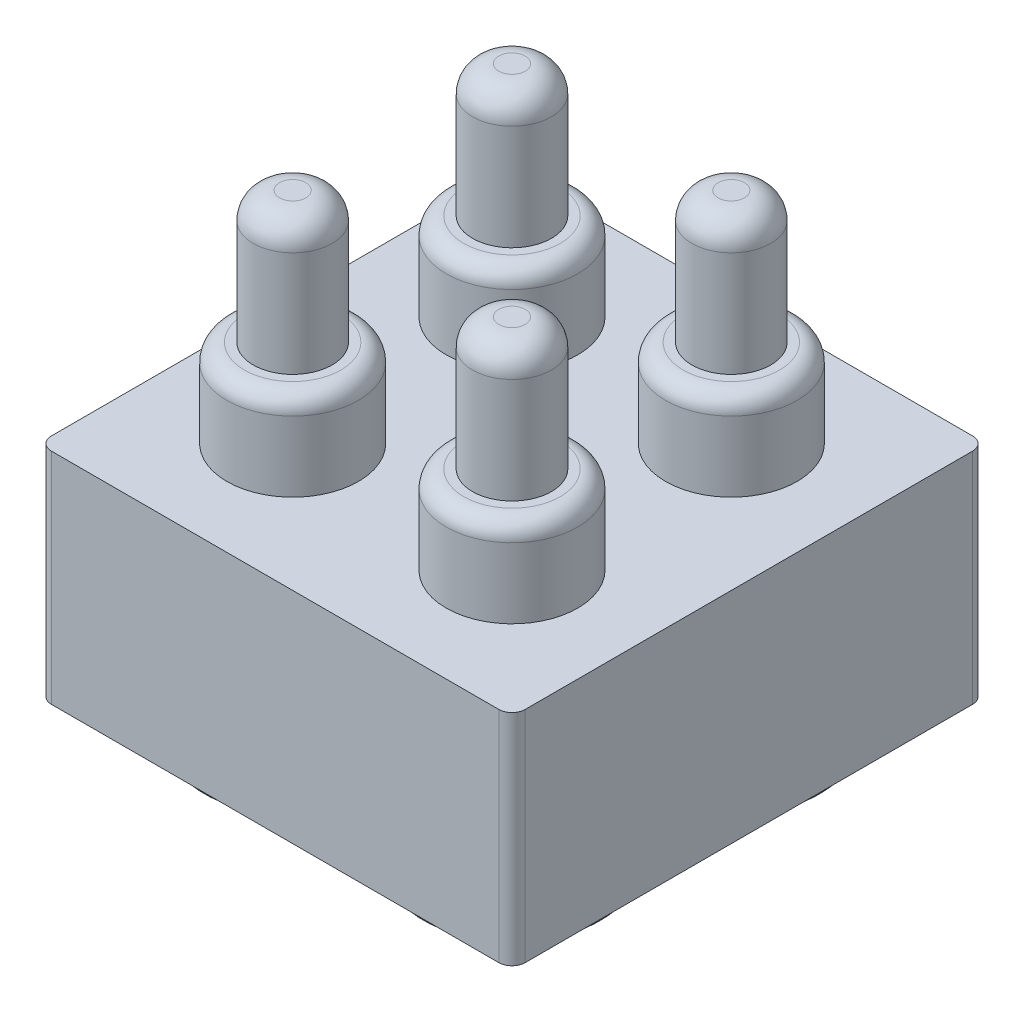
ISO-10303-21;
HEADER;
FILE_DESCRIPTION(('STEP AP214'),'2;1');
FILE_NAME('part.step','',(''),(''),'','','');
FILE_SCHEMA(('AUTOMOTIVE_DESIGN { 1 0 10303 214 1 1 1 1 }'));
ENDSEC;
DATA;
#1=APPLICATION_CONTEXT('core data for automotive mechanical design processes');
#2=APPLICATION_PROTOCOL_DEFINITION('international standard','automotive_design',2000,#1);
#3=PRODUCT_CONTEXT('',#1,'mechanical');
#4=PRODUCT('Part','Part','',(#3));
#5=PRODUCT_RELATED_PRODUCT_CATEGORY('part','',(#4));
#6=PRODUCT_DEFINITION_FORMATION('','',#4);
#7=PRODUCT_DEFINITION_CONTEXT('part definition',#1,'design');
#8=PRODUCT_DEFINITION('design','',#6,#7);
#9=PRODUCT_DEFINITION_SHAPE('','',#8);
#10=(LENGTH_UNIT() NAMED_UNIT(*) SI_UNIT(.MILLI.,.METRE.));
#11=(NAMED_UNIT(*) PLANE_ANGLE_UNIT() SI_UNIT($,.RADIAN.));
#12=(NAMED_UNIT(*) SI_UNIT($,.STERADIAN.) SOLID_ANGLE_UNIT());
#13=UNCERTAINTY_MEASURE_WITH_UNIT(LENGTH_MEASURE(1.E-05),#10,'distance_accuracy_value','');
#14=(GEOMETRIC_REPRESENTATION_CONTEXT(3) GLOBAL_UNCERTAINTY_ASSIGNED_CONTEXT((#13)) GLOBAL_UNIT_ASSIGNED_CONTEXT((#10,
#11,#12)) REPRESENTATION_CONTEXT('',''));
#15=CARTESIAN_POINT('',(0.,0.,0.));
#16=DIRECTION('',(0.,0.,1.));
#17=DIRECTION('',(1.,0.,0.));
#18=AXIS2_PLACEMENT_3D('',#15,#16,#17);
#19=CARTESIAN_POINT('',(-1.25,-0.5,-1.25));
#20=DIRECTION('',(0.,1.,0.));
#21=DIRECTION('',(0.,0.,1.));
#22=AXIS2_PLACEMENT_3D('',#19,#20,#21);
#23=CYLINDRICAL_SURFACE('',#22,1.05);
#24=CARTESIAN_POINT('',(-1.25,-0.35,-1.25));
#25=DIRECTION('',(0.,-1.,0.));
#26=DIRECTION('',(0.,0.,-1.));
#27=AXIS2_PLACEMENT_3D('',#24,#25,#26);
#28=CIRCLE('',#27,1.05);
#29=CARTESIAN_POINT('',(-1.25,-0.35,-2.3));
#30=VERTEX_POINT('',#29);
#31=EDGE_CURVE('E12',#30,#30,#28,.F.);
#32=ORIENTED_EDGE('',*,*,#31,.T.);
#33=EDGE_LOOP('',(#32));
#34=FACE_BOUND('',#33,.T.);
#35=CARTESIAN_POINT('',(-1.25,0.,-1.25));
#36=DIRECTION('',(0.,-1.,0.));
#37=DIRECTION('',(0.,0.,-1.));
#38=AXIS2_PLACEMENT_3D('',#35,#36,#37);
#39=CIRCLE('',#38,1.05);
#40=CARTESIAN_POINT('',(-1.25,0.,-2.3));
#41=VERTEX_POINT('',#40);
#42=EDGE_CURVE('E85',#41,#41,#39,.T.);
#43=ORIENTED_EDGE('',*,*,#42,.T.);
#44=EDGE_LOOP('',(#43));
#45=FACE_BOUND('',#44,.T.);
#46=ADVANCED_FACE('F74',(#34,#45),#23,.T.);
#47=CARTESIAN_POINT('',(-1.25,-0.5,-1.25));
#48=DIRECTION('',(0.,-1.,0.));
#49=DIRECTION('',(0.,0.,-1.));
#50=AXIS2_PLACEMENT_3D('',#47,#48,#49);
#51=PLANE('',#50);
#52=CARTESIAN_POINT('',(-1.25,-0.5,-1.25));
#53=DIRECTION('',(0.,-1.,0.));
#54=DIRECTION('',(0.,0.,-1.));
#55=AXIS2_PLACEMENT_3D('',#52,#53,#54);
#56=CIRCLE('',#55,0.9);
#57=CARTESIAN_POINT('',(-1.25,-0.5,-2.15));
#58=VERTEX_POINT('',#57);
#59=EDGE_CURVE('E81',#58,#58,#56,.T.);
#60=ORIENTED_EDGE('',*,*,#59,.T.);
#61=EDGE_LOOP('',(#60));
#62=FACE_BOUND('',#61,.T.);
#63=ADVANCED_FACE('F95',(#62),#51,.T.);
#64=CARTESIAN_POINT('',(-1.25,0.,-1.25));
#65=DIRECTION('',(0.,-1.,0.));
#66=DIRECTION('',(0.,0.,-1.));
#67=AXIS2_PLACEMENT_3D('',#64,#65,#66);
#68=PLANE('',#67);
#69=ORIENTED_EDGE('',*,*,#42,.F.);
#70=EDGE_LOOP('',(#69));
#71=FACE_BOUND('',#70,.T.);
#72=ADVANCED_FACE('F93',(#71),#68,.F.);
#73=CARTESIAN_POINT('',(-1.25,-0.35,-1.25));
#74=DIRECTION('',(0.,-1.,0.));
#75=DIRECTION('',(0.,0.,-1.));
#76=AXIS2_PLACEMENT_3D('',#73,#74,#75);
#77=TOROIDAL_SURFACE('',#76,0.9,0.15);
#78=ORIENTED_EDGE('',*,*,#31,.F.);
#79=EDGE_LOOP('',(#78));
#80=FACE_BOUND('',#79,.T.);
#81=ORIENTED_EDGE('',*,*,#59,.F.);
#82=EDGE_LOOP('',(#81));
#83=FACE_BOUND('',#82,.T.);
#84=ADVANCED_FACE('F76',(#80,#83),#77,.T.);
#85=CLOSED_SHELL('',(#46,#63,#72,#84));
#86=MANIFOLD_SOLID_BREP('B2',#85);
#87=CARTESIAN_POINT('',(1.25,-0.5,-1.25));
#88=DIRECTION('',(0.,1.,0.));
#89=DIRECTION('',(0.,0.,1.));
#90=AXIS2_PLACEMENT_3D('',#87,#88,#89);
#91=CYLINDRICAL_SURFACE('',#90,1.05);
#92=CARTESIAN_POINT('',(1.25,-0.35,-1.25));
#93=DIRECTION('',(0.,-1.,0.));
#94=DIRECTION('',(0.,0.,-1.));
#95=AXIS2_PLACEMENT_3D('',#92,#93,#94);
#96=CIRCLE('',#95,1.05);
#97=CARTESIAN_POINT('',(1.25,-0.35,-2.3));
#98=VERTEX_POINT('',#97);
#99=EDGE_CURVE('E73',#98,#98,#96,.F.);
#100=ORIENTED_EDGE('',*,*,#99,.T.);
#101=EDGE_LOOP('',(#100));
#102=FACE_BOUND('',#101,.T.);
#103=CARTESIAN_POINT('',(1.25,0.,-1.25));
#104=DIRECTION('',(0.,-1.,0.));
#105=DIRECTION('',(0.,0.,-1.));
#106=AXIS2_PLACEMENT_3D('',#103,#104,#105);
#107=CIRCLE('',#106,1.05);
#108=CARTESIAN_POINT('',(1.25,0.,-2.3));
#109=VERTEX_POINT('',#108);
#110=EDGE_CURVE('E149',#109,#109,#107,.T.);
#111=ORIENTED_EDGE('',*,*,#110,.T.);
#112=EDGE_LOOP('',(#111));
#113=FACE_BOUND('',#112,.T.);
#114=ADVANCED_FACE('F138',(#102,#113),#91,.T.);
#115=CARTESIAN_POINT('',(1.25,-0.5,-1.25));
#116=DIRECTION('',(0.,-1.,0.));
#117=DIRECTION('',(0.,0.,-1.));
#118=AXIS2_PLACEMENT_3D('',#115,#116,#117);
#119=PLANE('',#118);
#120=CARTESIAN_POINT('',(1.25,-0.5,-1.25));
#121=DIRECTION('',(0.,-1.,0.));
#122=DIRECTION('',(0.,0.,-1.));
#123=AXIS2_PLACEMENT_3D('',#120,#121,#122);
#124=CIRCLE('',#123,0.9);
#125=CARTESIAN_POINT('',(1.25,-0.5,-2.15));
#126=VERTEX_POINT('',#125);
#127=EDGE_CURVE('E145',#126,#126,#124,.T.);
#128=ORIENTED_EDGE('',*,*,#127,.T.);
#129=EDGE_LOOP('',(#128));
#130=FACE_BOUND('',#129,.T.);
#131=ADVANCED_FACE('F159',(#130),#119,.T.);
#132=CARTESIAN_POINT('',(1.25,0.,-1.25));
#133=DIRECTION('',(0.,-1.,0.));
#134=DIRECTION('',(0.,0.,-1.));
#135=AXIS2_PLACEMENT_3D('',#132,#133,#134);
#136=PLANE('',#135);
#137=ORIENTED_EDGE('',*,*,#110,.F.);
#138=EDGE_LOOP('',(#137));
#139=FACE_BOUND('',#138,.T.);
#140=ADVANCED_FACE('F157',(#139),#136,.F.);
#141=CARTESIAN_POINT('',(1.25,-0.35,-1.25));
#142=DIRECTION('',(0.,-1.,0.));
#143=DIRECTION('',(0.,0.,-1.));
#144=AXIS2_PLACEMENT_3D('',#141,#142,#143);
#145=TOROIDAL_SURFACE('',#144,0.9,0.15);
#146=ORIENTED_EDGE('',*,*,#99,.F.);
#147=EDGE_LOOP('',(#146));
#148=FACE_BOUND('',#147,.T.);
#149=ORIENTED_EDGE('',*,*,#127,.F.);
#150=EDGE_LOOP('',(#149));
#151=FACE_BOUND('',#150,.T.);
#152=ADVANCED_FACE('F140',(#148,#151),#145,.T.);
#153=CLOSED_SHELL('',(#114,#131,#140,#152));
#154=MANIFOLD_SOLID_BREP('B7',#153);
#155=CARTESIAN_POINT('',(1.25,-0.5,1.25));
#156=DIRECTION('',(0.,1.,0.));
#157=DIRECTION('',(0.,0.,1.));
#158=AXIS2_PLACEMENT_3D('',#155,#156,#157);
#159=CYLINDRICAL_SURFACE('',#158,1.05);
#160=CARTESIAN_POINT('',(1.25,-0.35,1.25));
#161=DIRECTION('',(0.,-1.,0.));
#162=DIRECTION('',(0.,0.,-1.));
#163=AXIS2_PLACEMENT_3D('',#160,#161,#162);
#164=CIRCLE('',#163,1.05);
#165=CARTESIAN_POINT('',(1.25,-0.35,0.2));
#166=VERTEX_POINT('',#165);
#167=EDGE_CURVE('E137',#166,#166,#164,.F.);
#168=ORIENTED_EDGE('',*,*,#167,.T.);
#169=EDGE_LOOP('',(#168));
#170=FACE_BOUND('',#169,.T.);
#171=CARTESIAN_POINT('',(1.25,0.,1.25));
#172=DIRECTION('',(0.,-1.,0.));
#173=DIRECTION('',(0.,0.,-1.));
#174=AXIS2_PLACEMENT_3D('',#171,#172,#173);
#175=CIRCLE('',#174,1.05);
#176=CARTESIAN_POINT('',(1.25,0.,0.2));
#177=VERTEX_POINT('',#176);
#178=EDGE_CURVE('E213',#177,#177,#175,.T.);
#179=ORIENTED_EDGE('',*,*,#178,.T.);
#180=EDGE_LOOP('',(#179));
#181=FACE_BOUND('',#180,.T.);
#182=ADVANCED_FACE('F202',(#170,#181),#159,.T.);
#183=CARTESIAN_POINT('',(1.25,-0.5,1.25));
#184=DIRECTION('',(0.,-1.,0.));
#185=DIRECTION('',(0.,0.,-1.));
#186=AXIS2_PLACEMENT_3D('',#183,#184,#185);
#187=PLANE('',#186);
#188=CARTESIAN_POINT('',(1.25,-0.5,1.25));
#189=DIRECTION('',(0.,-1.,0.));
#190=DIRECTION('',(0.,0.,-1.));
#191=AXIS2_PLACEMENT_3D('',#188,#189,#190);
#192=CIRCLE('',#191,0.9);
#193=CARTESIAN_POINT('',(1.25,-0.5,0.35));
#194=VERTEX_POINT('',#193);
#195=EDGE_CURVE('E209',#194,#194,#192,.T.);
#196=ORIENTED_EDGE('',*,*,#195,.T.);
#197=EDGE_LOOP('',(#196));
#198=FACE_BOUND('',#197,.T.);
#199=ADVANCED_FACE('F223',(#198),#187,.T.);
#200=CARTESIAN_POINT('',(1.25,0.,1.25));
#201=DIRECTION('',(0.,-1.,0.));
#202=DIRECTION('',(0.,0.,-1.));
#203=AXIS2_PLACEMENT_3D('',#200,#201,#202);
#204=PLANE('',#203);
#205=ORIENTED_EDGE('',*,*,#178,.F.);
#206=EDGE_LOOP('',(#205));
#207=FACE_BOUND('',#206,.T.);
#208=ADVANCED_FACE('F221',(#207),#204,.F.);
#209=CARTESIAN_POINT('',(1.25,-0.35,1.25));
#210=DIRECTION('',(0.,-1.,0.));
#211=DIRECTION('',(0.,0.,-1.));
#212=AXIS2_PLACEMENT_3D('',#209,#210,#211);
#213=TOROIDAL_SURFACE('',#212,0.9,0.15);
#214=ORIENTED_EDGE('',*,*,#167,.F.);
#215=EDGE_LOOP('',(#214));
#216=FACE_BOUND('',#215,.T.);
#217=ORIENTED_EDGE('',*,*,#195,.F.);
#218=EDGE_LOOP('',(#217));
#219=FACE_BOUND('',#218,.T.);
#220=ADVANCED_FACE('F204',(#216,#219),#213,.T.);
#221=CLOSED_SHELL('',(#182,#199,#208,#220));
#222=MANIFOLD_SOLID_BREP('B68',#221);
#223=CARTESIAN_POINT('',(-1.25,-0.5,1.25));
#224=DIRECTION('',(0.,1.,0.));
#225=DIRECTION('',(0.,0.,1.));
#226=AXIS2_PLACEMENT_3D('',#223,#224,#225);
#227=CYLINDRICAL_SURFACE('',#226,1.05);
#228=CARTESIAN_POINT('',(-1.25,-0.35,1.25));
#229=DIRECTION('',(0.,-1.,0.));
#230=DIRECTION('',(0.,0.,-1.));
#231=AXIS2_PLACEMENT_3D('',#228,#229,#230);
#232=CIRCLE('',#231,1.05);
#233=CARTESIAN_POINT('',(-1.25,-0.35,0.199999999999998));
#234=VERTEX_POINT('',#233);
#235=EDGE_CURVE('E201',#234,#234,#232,.F.);
#236=ORIENTED_EDGE('',*,*,#235,.T.);
#237=EDGE_LOOP('',(#236));
#238=FACE_BOUND('',#237,.T.);
#239=CARTESIAN_POINT('',(-1.25,0.,1.25));
#240=DIRECTION('',(0.,-1.,0.));
#241=DIRECTION('',(0.,0.,-1.));
#242=AXIS2_PLACEMENT_3D('',#239,#240,#241);
#243=CIRCLE('',#242,1.05);
#244=CARTESIAN_POINT('',(-1.25,0.,0.199999999999998));
#245=VERTEX_POINT('',#244);
#246=EDGE_CURVE('E277',#245,#245,#243,.T.);
#247=ORIENTED_EDGE('',*,*,#246,.T.);
#248=EDGE_LOOP('',(#247));
#249=FACE_BOUND('',#248,.T.);
#250=ADVANCED_FACE('F266',(#238,#249),#227,.T.);
#251=CARTESIAN_POINT('',(-1.25,-0.5,1.25));
#252=DIRECTION('',(0.,-1.,0.));
#253=DIRECTION('',(0.,0.,-1.));
#254=AXIS2_PLACEMENT_3D('',#251,#252,#253);
#255=PLANE('',#254);
#256=CARTESIAN_POINT('',(-1.25,-0.5,1.25));
#257=DIRECTION('',(0.,-1.,0.));
#258=DIRECTION('',(0.,0.,-1.));
#259=AXIS2_PLACEMENT_3D('',#256,#257,#258);
#260=CIRCLE('',#259,0.9);
#261=CARTESIAN_POINT('',(-1.25,-0.5,0.349999999999998));
#262=VERTEX_POINT('',#261);
#263=EDGE_CURVE('E273',#262,#262,#260,.T.);
#264=ORIENTED_EDGE('',*,*,#263,.T.);
#265=EDGE_LOOP('',(#264));
#266=FACE_BOUND('',#265,.T.);
#267=ADVANCED_FACE('F287',(#266),#255,.T.);
#268=CARTESIAN_POINT('',(-1.25,0.,1.25));
#269=DIRECTION('',(0.,-1.,0.));
#270=DIRECTION('',(0.,0.,-1.));
#271=AXIS2_PLACEMENT_3D('',#268,#269,#270);
#272=PLANE('',#271);
#273=ORIENTED_EDGE('',*,*,#246,.F.);
#274=EDGE_LOOP('',(#273));
#275=FACE_BOUND('',#274,.T.);
#276=ADVANCED_FACE('F285',(#275),#272,.F.);
#277=CARTESIAN_POINT('',(-1.25,-0.35,1.25));
#278=DIRECTION('',(0.,-1.,0.));
#279=DIRECTION('',(0.,0.,-1.));
#280=AXIS2_PLACEMENT_3D('',#277,#278,#279);
#281=TOROIDAL_SURFACE('',#280,0.9,0.15);
#282=ORIENTED_EDGE('',*,*,#235,.F.);
#283=EDGE_LOOP('',(#282));
#284=FACE_BOUND('',#283,.T.);
#285=ORIENTED_EDGE('',*,*,#263,.F.);
#286=EDGE_LOOP('',(#285));
#287=FACE_BOUND('',#286,.T.);
#288=ADVANCED_FACE('F268',(#284,#287),#281,.T.);
#289=CLOSED_SHELL('',(#250,#267,#276,#288));
#290=MANIFOLD_SOLID_BREP('B132',#289);
#291=CARTESIAN_POINT('',(1.25,3.5,1.25));
#292=DIRECTION('',(0.,-1.,0.));
#293=DIRECTION('',(0.,0.,-1.));
#294=AXIS2_PLACEMENT_3D('',#291,#292,#293);
#295=CYLINDRICAL_SURFACE('',#294,0.749999999999999);
#296=CARTESIAN_POINT('',(1.25,3.3,1.25));
#297=DIRECTION('',(0.,1.,0.));
#298=DIRECTION('',(0.,0.,1.));
#299=AXIS2_PLACEMENT_3D('',#296,#297,#298);
#300=CIRCLE('',#299,0.749999999999999);
#301=CARTESIAN_POINT('',(1.25,3.3,2.));
#302=VERTEX_POINT('',#301);
#303=EDGE_CURVE('E341',#302,#302,#300,.F.);
#304=ORIENTED_EDGE('',*,*,#303,.T.);
#305=EDGE_LOOP('',(#304));
#306=FACE_BOUND('',#305,.T.);
#307=CARTESIAN_POINT('',(1.25,2.5,1.25));
#308=DIRECTION('',(0.,1.,0.));
#309=DIRECTION('',(0.,0.,1.));
#310=AXIS2_PLACEMENT_3D('',#307,#308,#309);
#311=CIRCLE('',#310,0.749999999999999);
#312=CARTESIAN_POINT('',(1.25,2.5,2.));
#313=VERTEX_POINT('',#312);
#314=EDGE_CURVE('E351',#313,#313,#311,.T.);
#315=ORIENTED_EDGE('',*,*,#314,.T.);
#316=EDGE_LOOP('',(#315));
#317=FACE_BOUND('',#316,.T.);
#318=ADVANCED_FACE('F330',(#306,#317),#295,.T.);
#319=CARTESIAN_POINT('',(0.,3.5,0.));
#320=DIRECTION('',(0.,1.,0.));
#321=DIRECTION('',(0.,0.,1.));
#322=AXIS2_PLACEMENT_3D('',#319,#320,#321);
#323=PLANE('',#322);
#324=CARTESIAN_POINT('',(1.25,3.5,1.25));
#325=DIRECTION('',(0.,1.,0.));
#326=DIRECTION('',(0.,0.,1.));
#327=AXIS2_PLACEMENT_3D('',#324,#325,#326);
#328=CIRCLE('',#327,0.549999999999999);
#329=CARTESIAN_POINT('',(1.25,3.5,1.8));
#330=VERTEX_POINT('',#329);
#331=EDGE_CURVE('E345',#330,#330,#328,.T.);
#332=ORIENTED_EDGE('',*,*,#331,.T.);
#333=EDGE_LOOP('',(#332));
#334=FACE_BOUND('',#333,.T.);
#335=CARTESIAN_POINT('',(1.25,3.5,1.25));
#336=DIRECTION('',(0.,1.,0.));
#337=DIRECTION('',(0.,0.,1.));
#338=AXIS2_PLACEMENT_3D('',#335,#336,#337);
#339=CIRCLE('',#338,0.449999999999999);
#340=CARTESIAN_POINT('',(1.25,3.5,1.7));
#341=VERTEX_POINT('',#340);
#342=EDGE_CURVE('E350',#341,#341,#339,.T.);
#343=ORIENTED_EDGE('',*,*,#342,.F.);
#344=EDGE_LOOP('',(#343));
#345=FACE_BOUND('',#344,.T.);
#346=ADVANCED_FACE('F359',(#334,#345),#323,.T.);
#347=CARTESIAN_POINT('',(0.,2.5,0.));
#348=DIRECTION('',(0.,1.,0.));
#349=DIRECTION('',(0.,0.,1.));
#350=AXIS2_PLACEMENT_3D('',#347,#348,#349);
#351=PLANE('',#350);
#352=ORIENTED_EDGE('',*,*,#314,.F.);
#353=EDGE_LOOP('',(#352));
#354=FACE_BOUND('',#353,.T.);
#355=ADVANCED_FACE('F361',(#354),#351,.F.);
#356=CARTESIAN_POINT('',(1.25,5.,1.25));
#357=DIRECTION('',(0.,-1.,0.));
#358=DIRECTION('',(0.,0.,-1.));
#359=AXIS2_PLACEMENT_3D('',#356,#357,#358);
#360=CYLINDRICAL_SURFACE('',#359,0.449999999999999);
#361=CARTESIAN_POINT('',(1.25,4.7,1.25));
#362=DIRECTION('',(0.,1.,0.));
#363=DIRECTION('',(0.,0.,1.));
#364=AXIS2_PLACEMENT_3D('',#361,#362,#363);
#365=CIRCLE('',#364,0.449999999999999);
#366=CARTESIAN_POINT('',(1.25,4.7,1.7));
#367=VERTEX_POINT('',#366);
#368=EDGE_CURVE('E265',#367,#367,#365,.F.);
#369=ORIENTED_EDGE('',*,*,#368,.T.);
#370=EDGE_LOOP('',(#369));
#371=FACE_BOUND('',#370,.T.);
#372=ORIENTED_EDGE('',*,*,#342,.T.);
#373=EDGE_LOOP('',(#372));
#374=FACE_BOUND('',#373,.T.);
#375=ADVANCED_FACE('F357',(#371,#374),#360,.T.);
#376=CARTESIAN_POINT('',(1.25,5.,1.25));
#377=DIRECTION('',(0.,1.,0.));
#378=DIRECTION('',(0.,0.,1.));
#379=AXIS2_PLACEMENT_3D('',#376,#377,#378);
#380=PLANE('',#379);
#381=CARTESIAN_POINT('',(1.25,5.,1.25));
#382=DIRECTION('',(0.,1.,0.));
#383=DIRECTION('',(0.,0.,1.));
#384=AXIS2_PLACEMENT_3D('',#381,#382,#383);
#385=CIRCLE('',#384,0.149999999999999);
#386=CARTESIAN_POINT('',(1.25,5.,1.4));
#387=VERTEX_POINT('',#386);
#388=EDGE_CURVE('E337',#387,#387,#385,.T.);
#389=ORIENTED_EDGE('',*,*,#388,.T.);
#390=EDGE_LOOP('',(#389));
#391=FACE_BOUND('',#390,.T.);
#392=ADVANCED_FACE('F376',(#391),#380,.T.);
#393=CARTESIAN_POINT('',(1.25,3.3,1.25));
#394=DIRECTION('',(0.,1.,0.));
#395=DIRECTION('',(0.,0.,1.));
#396=AXIS2_PLACEMENT_3D('',#393,#394,#395);
#397=TOROIDAL_SURFACE('',#396,0.549999999999999,0.2);
#398=ORIENTED_EDGE('',*,*,#303,.F.);
#399=EDGE_LOOP('',(#398));
#400=FACE_BOUND('',#399,.T.);
#401=ORIENTED_EDGE('',*,*,#331,.F.);
#402=EDGE_LOOP('',(#401));
#403=FACE_BOUND('',#402,.T.);
#404=ADVANCED_FACE('F374',(#400,#403),#397,.T.);
#405=CARTESIAN_POINT('',(1.25,4.7,1.25));
#406=DIRECTION('',(0.,1.,0.));
#407=DIRECTION('',(0.,0.,1.));
#408=AXIS2_PLACEMENT_3D('',#405,#406,#407);
#409=DEGENERATE_TOROIDAL_SURFACE('',#408,0.149999999999999,0.3,.T.);
#410=ORIENTED_EDGE('',*,*,#368,.F.);
#411=EDGE_LOOP('',(#410));
#412=FACE_BOUND('',#411,.T.);
#413=ORIENTED_EDGE('',*,*,#388,.F.);
#414=EDGE_LOOP('',(#413));
#415=FACE_BOUND('',#414,.T.);
#416=ADVANCED_FACE('F332',(#412,#415),#409,.T.);
#417=CLOSED_SHELL('',(#318,#346,#355,#375,#392,#404,#416));
#418=MANIFOLD_SOLID_BREP('B196',#417);
#419=CARTESIAN_POINT('',(-1.25,3.5,1.25));
#420=DIRECTION('',(0.,-1.,0.));
#421=DIRECTION('',(0.,0.,-1.));
#422=AXIS2_PLACEMENT_3D('',#419,#420,#421);
#423=CYLINDRICAL_SURFACE('',#422,0.749999999999999);
#424=CARTESIAN_POINT('',(-1.25,3.3,1.25));
#425=DIRECTION('',(0.,1.,0.));
#426=DIRECTION('',(0.,0.,1.));
#427=AXIS2_PLACEMENT_3D('',#424,#425,#426);
#428=CIRCLE('',#427,0.749999999999999);
#429=CARTESIAN_POINT('',(-1.25,3.3,2.));
#430=VERTEX_POINT('',#429);
#431=EDGE_CURVE('E475',#430,#430,#428,.F.);
#432=ORIENTED_EDGE('',*,*,#431,.T.);
#433=EDGE_LOOP('',(#432));
#434=FACE_BOUND('',#433,.T.);
#435=CARTESIAN_POINT('',(-1.25,2.5,1.25));
#436=DIRECTION('',(0.,1.,0.));
#437=DIRECTION('',(0.,0.,1.));
#438=AXIS2_PLACEMENT_3D('',#435,#436,#437);
#439=CIRCLE('',#438,0.749999999999999);
#440=CARTESIAN_POINT('',(-1.25,2.5,2.));
#441=VERTEX_POINT('',#440);
#442=EDGE_CURVE('E481',#441,#441,#439,.F.);
#443=ORIENTED_EDGE('',*,*,#442,.F.);
#444=EDGE_LOOP('',(#443));
#445=FACE_BOUND('',#444,.T.);
#446=ADVANCED_FACE('F460',(#434,#445),#423,.T.);
#447=CARTESIAN_POINT('',(0.,3.5,0.));
#448=DIRECTION('',(0.,1.,0.));
#449=DIRECTION('',(0.,0.,1.));
#450=AXIS2_PLACEMENT_3D('',#447,#448,#449);
#451=PLANE('',#450);
#452=CARTESIAN_POINT('',(-1.25,3.5,1.25));
#453=DIRECTION('',(0.,1.,0.));
#454=DIRECTION('',(0.,0.,1.));
#455=AXIS2_PLACEMENT_3D('',#452,#453,#454);
#456=CIRCLE('',#455,0.549999999999999);
#457=CARTESIAN_POINT('',(-1.25,3.5,1.8));
#458=VERTEX_POINT('',#457);
#459=EDGE_CURVE('E471',#458,#458,#456,.T.);
#460=ORIENTED_EDGE('',*,*,#459,.T.);
#461=EDGE_LOOP('',(#460));
#462=FACE_BOUND('',#461,.T.);
#463=CARTESIAN_POINT('',(-1.25,3.5,1.25));
#464=DIRECTION('',(0.,1.,0.));
#465=DIRECTION('',(0.,0.,-1.));
#466=AXIS2_PLACEMENT_3D('',#463,#464,#465);
#467=CIRCLE('',#466,0.45);
#468=CARTESIAN_POINT('',(-1.25,3.5,0.799999999999998));
#469=VERTEX_POINT('',#468);
#470=EDGE_CURVE('E480',#469,#469,#467,.T.);
#471=ORIENTED_EDGE('',*,*,#470,.F.);
#472=EDGE_LOOP('',(#471));
#473=FACE_BOUND('',#472,.T.);
#474=ADVANCED_FACE('F489',(#462,#473),#451,.T.);
#475=CARTESIAN_POINT('',(0.,2.5,0.));
#476=DIRECTION('',(0.,1.,0.));
#477=DIRECTION('',(0.,0.,1.));
#478=AXIS2_PLACEMENT_3D('',#475,#476,#477);
#479=PLANE('',#478);
#480=ORIENTED_EDGE('',*,*,#442,.T.);
#481=EDGE_LOOP('',(#480));
#482=FACE_BOUND('',#481,.T.);
#483=ADVANCED_FACE('F491',(#482),#479,.F.);
#484=CARTESIAN_POINT('',(-1.25,5.,1.25));
#485=DIRECTION('',(0.,-1.,0.));
#486=DIRECTION('',(0.,0.,-1.));
#487=AXIS2_PLACEMENT_3D('',#484,#485,#486);
#488=CYLINDRICAL_SURFACE('',#487,0.45);
#489=CARTESIAN_POINT('',(-1.25,4.7,1.25));
#490=DIRECTION('',(0.,-1.,0.));
#491=DIRECTION('',(0.,0.,-1.));
#492=AXIS2_PLACEMENT_3D('',#489,#490,#491);
#493=CIRCLE('',#492,0.45);
#494=CARTESIAN_POINT('',(-1.25,4.7,0.799999999999998));
#495=VERTEX_POINT('',#494);
#496=EDGE_CURVE('E329',#495,#495,#493,.T.);
#497=ORIENTED_EDGE('',*,*,#496,.T.);
#498=EDGE_LOOP('',(#497));
#499=FACE_BOUND('',#498,.T.);
#500=ORIENTED_EDGE('',*,*,#470,.T.);
#501=EDGE_LOOP('',(#500));
#502=FACE_BOUND('',#501,.T.);
#503=ADVANCED_FACE('F487',(#499,#502),#488,.T.);
#504=CARTESIAN_POINT('',(-1.25,5.,1.25));
#505=DIRECTION('',(0.,-1.,0.));
#506=DIRECTION('',(0.,0.,-1.));
#507=AXIS2_PLACEMENT_3D('',#504,#505,#506);
#508=PLANE('',#507);
#509=CARTESIAN_POINT('',(-1.25,5.,1.25));
#510=DIRECTION('',(0.,-1.,0.));
#511=DIRECTION('',(0.,0.,-1.));
#512=AXIS2_PLACEMENT_3D('',#509,#510,#511);
#513=CIRCLE('',#512,0.15);
#514=CARTESIAN_POINT('',(-1.25,5.,1.1));
#515=VERTEX_POINT('',#514);
#516=EDGE_CURVE('E467',#515,#515,#513,.F.);
#517=ORIENTED_EDGE('',*,*,#516,.T.);
#518=EDGE_LOOP('',(#517));
#519=FACE_BOUND('',#518,.T.);
#520=ADVANCED_FACE('F506',(#519),#508,.F.);
#521=CARTESIAN_POINT('',(-1.25,3.3,1.25));
#522=DIRECTION('',(0.,1.,0.));
#523=DIRECTION('',(0.,0.,1.));
#524=AXIS2_PLACEMENT_3D('',#521,#522,#523);
#525=TOROIDAL_SURFACE('',#524,0.549999999999999,0.2);
#526=ORIENTED_EDGE('',*,*,#459,.F.);
#527=EDGE_LOOP('',(#526));
#528=FACE_BOUND('',#527,.T.);
#529=ORIENTED_EDGE('',*,*,#431,.F.);
#530=EDGE_LOOP('',(#529));
#531=FACE_BOUND('',#530,.T.);
#532=ADVANCED_FACE('F504',(#528,#531),#525,.T.);
#533=CARTESIAN_POINT('',(-1.25,4.7,1.25));
#534=DIRECTION('',(0.,-1.,0.));
#535=DIRECTION('',(0.,0.,-1.));
#536=AXIS2_PLACEMENT_3D('',#533,#534,#535);
#537=DEGENERATE_TOROIDAL_SURFACE('',#536,0.15,0.3,.T.);
#538=ORIENTED_EDGE('',*,*,#496,.F.);
#539=EDGE_LOOP('',(#538));
#540=FACE_BOUND('',#539,.T.);
#541=ORIENTED_EDGE('',*,*,#516,.F.);
#542=EDGE_LOOP('',(#541));
#543=FACE_BOUND('',#542,.T.);
#544=ADVANCED_FACE('F462',(#540,#543),#537,.T.);
#545=CLOSED_SHELL('',(#446,#474,#483,#503,#520,#532,#544));
#546=MANIFOLD_SOLID_BREP('B260',#545);
#547=CARTESIAN_POINT('',(1.25,3.5,-1.25));
#548=DIRECTION('',(0.,-1.,0.));
#549=DIRECTION('',(0.,0.,-1.));
#550=AXIS2_PLACEMENT_3D('',#547,#548,#549);
#551=CYLINDRICAL_SURFACE('',#550,0.75);
#552=CARTESIAN_POINT('',(1.25,3.3,-1.25));
#553=DIRECTION('',(0.,1.,0.));
#554=DIRECTION('',(0.,0.,1.));
#555=AXIS2_PLACEMENT_3D('',#552,#553,#554);
#556=CIRCLE('',#555,0.75);
#557=CARTESIAN_POINT('',(1.25,3.3,-0.5));
#558=VERTEX_POINT('',#557);
#559=EDGE_CURVE('E605',#558,#558,#556,.F.);
#560=ORIENTED_EDGE('',*,*,#559,.T.);
#561=EDGE_LOOP('',(#560));
#562=FACE_BOUND('',#561,.T.);
#563=CARTESIAN_POINT('',(1.25,2.5,-1.25));
#564=DIRECTION('',(0.,1.,0.));
#565=DIRECTION('',(0.,0.,1.));
#566=AXIS2_PLACEMENT_3D('',#563,#564,#565);
#567=CIRCLE('',#566,0.75);
#568=CARTESIAN_POINT('',(1.25,2.5,-0.5));
#569=VERTEX_POINT('',#568);
#570=EDGE_CURVE('E611',#569,#569,#567,.F.);
#571=ORIENTED_EDGE('',*,*,#570,.F.);
#572=EDGE_LOOP('',(#571));
#573=FACE_BOUND('',#572,.T.);
#574=ADVANCED_FACE('F590',(#562,#573),#551,.T.);
#575=CARTESIAN_POINT('',(0.,3.5,0.));
#576=DIRECTION('',(0.,1.,0.));
#577=DIRECTION('',(0.,0.,1.));
#578=AXIS2_PLACEMENT_3D('',#575,#576,#577);
#579=PLANE('',#578);
#580=CARTESIAN_POINT('',(1.25,3.5,-1.25));
#581=DIRECTION('',(0.,1.,0.));
#582=DIRECTION('',(0.,0.,1.));
#583=AXIS2_PLACEMENT_3D('',#580,#581,#582);
#584=CIRCLE('',#583,0.55);
#585=CARTESIAN_POINT('',(1.25,3.5,-0.7));
#586=VERTEX_POINT('',#585);
#587=EDGE_CURVE('E601',#586,#586,#584,.T.);
#588=ORIENTED_EDGE('',*,*,#587,.T.);
#589=EDGE_LOOP('',(#588));
#590=FACE_BOUND('',#589,.T.);
#591=CARTESIAN_POINT('',(1.25,3.5,-1.25));
#592=DIRECTION('',(0.,1.,0.));
#593=DIRECTION('',(0.,0.,-1.));
#594=AXIS2_PLACEMENT_3D('',#591,#592,#593);
#595=CIRCLE('',#594,0.45);
#596=CARTESIAN_POINT('',(1.25,3.5,-1.7));
#597=VERTEX_POINT('',#596);
#598=EDGE_CURVE('E610',#597,#597,#595,.T.);
#599=ORIENTED_EDGE('',*,*,#598,.F.);
#600=EDGE_LOOP('',(#599));
#601=FACE_BOUND('',#600,.T.);
#602=ADVANCED_FACE('F619',(#590,#601),#579,.T.);
#603=CARTESIAN_POINT('',(0.,2.5,0.));
#604=DIRECTION('',(0.,1.,0.));
#605=DIRECTION('',(0.,0.,1.));
#606=AXIS2_PLACEMENT_3D('',#603,#604,#605);
#607=PLANE('',#606);
#608=ORIENTED_EDGE('',*,*,#570,.T.);
#609=EDGE_LOOP('',(#608));
#610=FACE_BOUND('',#609,.T.);
#611=ADVANCED_FACE('F621',(#610),#607,.F.);
#612=CARTESIAN_POINT('',(1.25,5.,-1.25));
#613=DIRECTION('',(0.,-1.,0.));
#614=DIRECTION('',(0.,0.,-1.));
#615=AXIS2_PLACEMENT_3D('',#612,#613,#614);
#616=CYLINDRICAL_SURFACE('',#615,0.45);
#617=CARTESIAN_POINT('',(1.25,4.7,-1.25));
#618=DIRECTION('',(0.,-1.,0.));
#619=DIRECTION('',(0.,0.,-1.));
#620=AXIS2_PLACEMENT_3D('',#617,#618,#619);
#621=CIRCLE('',#620,0.45);
#622=CARTESIAN_POINT('',(1.25,4.7,-1.7));
#623=VERTEX_POINT('',#622);
#624=EDGE_CURVE('E459',#623,#623,#621,.T.);
#625=ORIENTED_EDGE('',*,*,#624,.T.);
#626=EDGE_LOOP('',(#625));
#627=FACE_BOUND('',#626,.T.);
#628=ORIENTED_EDGE('',*,*,#598,.T.);
#629=EDGE_LOOP('',(#628));
#630=FACE_BOUND('',#629,.T.);
#631=ADVANCED_FACE('F617',(#627,#630),#616,.T.);
#632=CARTESIAN_POINT('',(1.25,5.,-1.25));
#633=DIRECTION('',(0.,-1.,0.));
#634=DIRECTION('',(0.,0.,-1.));
#635=AXIS2_PLACEMENT_3D('',#632,#633,#634);
#636=PLANE('',#635);
#637=CARTESIAN_POINT('',(1.25,5.,-1.25));
#638=DIRECTION('',(0.,-1.,0.));
#639=DIRECTION('',(0.,0.,-1.));
#640=AXIS2_PLACEMENT_3D('',#637,#638,#639);
#641=CIRCLE('',#640,0.15);
#642=CARTESIAN_POINT('',(1.25,5.,-1.4));
#643=VERTEX_POINT('',#642);
#644=EDGE_CURVE('E597',#643,#643,#641,.F.);
#645=ORIENTED_EDGE('',*,*,#644,.T.);
#646=EDGE_LOOP('',(#645));
#647=FACE_BOUND('',#646,.T.);
#648=ADVANCED_FACE('F636',(#647),#636,.F.);
#649=CARTESIAN_POINT('',(1.25,3.3,-1.25));
#650=DIRECTION('',(0.,1.,0.));
#651=DIRECTION('',(0.,0.,1.));
#652=AXIS2_PLACEMENT_3D('',#649,#650,#651);
#653=TOROIDAL_SURFACE('',#652,0.55,0.2);
#654=ORIENTED_EDGE('',*,*,#587,.F.);
#655=EDGE_LOOP('',(#654));
#656=FACE_BOUND('',#655,.T.);
#657=ORIENTED_EDGE('',*,*,#559,.F.);
#658=EDGE_LOOP('',(#657));
#659=FACE_BOUND('',#658,.T.);
#660=ADVANCED_FACE('F634',(#656,#659),#653,.T.);
#661=CARTESIAN_POINT('',(1.25,4.7,-1.25));
#662=DIRECTION('',(0.,-1.,0.));
#663=DIRECTION('',(0.,0.,-1.));
#664=AXIS2_PLACEMENT_3D('',#661,#662,#663);
#665=DEGENERATE_TOROIDAL_SURFACE('',#664,0.15,0.3,.T.);
#666=ORIENTED_EDGE('',*,*,#624,.F.);
#667=EDGE_LOOP('',(#666));
#668=FACE_BOUND('',#667,.T.);
#669=ORIENTED_EDGE('',*,*,#644,.F.);
#670=EDGE_LOOP('',(#669));
#671=FACE_BOUND('',#670,.T.);
#672=ADVANCED_FACE('F592',(#668,#671),#665,.T.);
#673=CLOSED_SHELL('',(#574,#602,#611,#631,#648,#660,#672));
#674=MANIFOLD_SOLID_BREP('B324',#673);
#675=CARTESIAN_POINT('',(-1.25,3.5,-1.25));
#676=DIRECTION('',(0.,-1.,0.));
#677=DIRECTION('',(0.,0.,-1.));
#678=AXIS2_PLACEMENT_3D('',#675,#676,#677);
#679=CYLINDRICAL_SURFACE('',#678,0.75);
#680=CARTESIAN_POINT('',(-1.25,3.3,-1.25));
#681=DIRECTION('',(0.,1.,0.));
#682=DIRECTION('',(0.,0.,1.));
#683=AXIS2_PLACEMENT_3D('',#680,#681,#682);
#684=CIRCLE('',#683,0.75);
#685=CARTESIAN_POINT('',(-1.25,3.3,-0.5));
#686=VERTEX_POINT('',#685);
#687=EDGE_CURVE('E732',#686,#686,#684,.F.);
#688=ORIENTED_EDGE('',*,*,#687,.T.);
#689=EDGE_LOOP('',(#688));
#690=FACE_BOUND('',#689,.T.);
#691=CARTESIAN_POINT('',(-1.25,2.5,-1.25));
#692=DIRECTION('',(0.,1.,0.));
#693=DIRECTION('',(0.,0.,1.));
#694=AXIS2_PLACEMENT_3D('',#691,#692,#693);
#695=CIRCLE('',#694,0.75);
#696=CARTESIAN_POINT('',(-1.25,2.5,-0.5));
#697=VERTEX_POINT('',#696);
#698=EDGE_CURVE('E742',#697,#697,#695,.T.);
#699=ORIENTED_EDGE('',*,*,#698,.T.);
#700=EDGE_LOOP('',(#699));
#701=FACE_BOUND('',#700,.T.);
#702=ADVANCED_FACE('F721',(#690,#701),#679,.T.);
#703=CARTESIAN_POINT('',(0.,3.5,0.));
#704=DIRECTION('',(0.,1.,0.));
#705=DIRECTION('',(0.,0.,1.));
#706=AXIS2_PLACEMENT_3D('',#703,#704,#705);
#707=PLANE('',#706);
#708=CARTESIAN_POINT('',(-1.25,3.5,-1.25));
#709=DIRECTION('',(0.,1.,0.));
#710=DIRECTION('',(0.,0.,1.));
#711=AXIS2_PLACEMENT_3D('',#708,#709,#710);
#712=CIRCLE('',#711,0.55);
#713=CARTESIAN_POINT('',(-1.25,3.5,-0.7));
#714=VERTEX_POINT('',#713);
#715=EDGE_CURVE('E736',#714,#714,#712,.T.);
#716=ORIENTED_EDGE('',*,*,#715,.T.);
#717=EDGE_LOOP('',(#716));
#718=FACE_BOUND('',#717,.T.);
#719=CARTESIAN_POINT('',(-1.25,3.5,-1.25));
#720=DIRECTION('',(0.,1.,0.));
#721=DIRECTION('',(0.,0.,1.));
#722=AXIS2_PLACEMENT_3D('',#719,#720,#721);
#723=CIRCLE('',#722,0.45);
#724=CARTESIAN_POINT('',(-1.25,3.5,-0.8));
#725=VERTEX_POINT('',#724);
#726=EDGE_CURVE('E741',#725,#725,#723,.T.);
#727=ORIENTED_EDGE('',*,*,#726,.F.);
#728=EDGE_LOOP('',(#727));
#729=FACE_BOUND('',#728,.T.);
#730=ADVANCED_FACE('F750',(#718,#729),#707,.T.);
#731=CARTESIAN_POINT('',(0.,2.5,0.));
#732=DIRECTION('',(0.,1.,0.));
#733=DIRECTION('',(0.,0.,1.));
#734=AXIS2_PLACEMENT_3D('',#731,#732,#733);
#735=PLANE('',#734);
#736=ORIENTED_EDGE('',*,*,#698,.F.);
#737=EDGE_LOOP('',(#736));
#738=FACE_BOUND('',#737,.T.);
#739=ADVANCED_FACE('F752',(#738),#735,.F.);
#740=CARTESIAN_POINT('',(-1.25,5.,-1.25));
#741=DIRECTION('',(0.,-1.,0.));
#742=DIRECTION('',(0.,0.,-1.));
#743=AXIS2_PLACEMENT_3D('',#740,#741,#742);
#744=CYLINDRICAL_SURFACE('',#743,0.45);
#745=CARTESIAN_POINT('',(-1.25,4.7,-1.25));
#746=DIRECTION('',(0.,1.,0.));
#747=DIRECTION('',(0.,0.,1.));
#748=AXIS2_PLACEMENT_3D('',#745,#746,#747);
#749=CIRCLE('',#748,0.45);
#750=CARTESIAN_POINT('',(-1.25,4.7,-0.8));
#751=VERTEX_POINT('',#750);
#752=EDGE_CURVE('E589',#751,#751,#749,.F.);
#753=ORIENTED_EDGE('',*,*,#752,.T.);
#754=EDGE_LOOP('',(#753));
#755=FACE_BOUND('',#754,.T.);
#756=ORIENTED_EDGE('',*,*,#726,.T.);
#757=EDGE_LOOP('',(#756));
#758=FACE_BOUND('',#757,.T.);
#759=ADVANCED_FACE('F748',(#755,#758),#744,.T.);
#760=CARTESIAN_POINT('',(-1.25,5.,-1.25));
#761=DIRECTION('',(0.,1.,0.));
#762=DIRECTION('',(0.,0.,1.));
#763=AXIS2_PLACEMENT_3D('',#760,#761,#762);
#764=PLANE('',#763);
#765=CARTESIAN_POINT('',(-1.25,5.,-1.25));
#766=DIRECTION('',(0.,1.,0.));
#767=DIRECTION('',(0.,0.,1.));
#768=AXIS2_PLACEMENT_3D('',#765,#766,#767);
#769=CIRCLE('',#768,0.15);
#770=CARTESIAN_POINT('',(-1.25,5.,-1.1));
#771=VERTEX_POINT('',#770);
#772=EDGE_CURVE('E728',#771,#771,#769,.T.);
#773=ORIENTED_EDGE('',*,*,#772,.T.);
#774=EDGE_LOOP('',(#773));
#775=FACE_BOUND('',#774,.T.);
#776=ADVANCED_FACE('F767',(#775),#764,.T.);
#777=CARTESIAN_POINT('',(-1.25,3.3,-1.25));
#778=DIRECTION('',(0.,1.,0.));
#779=DIRECTION('',(0.,0.,1.));
#780=AXIS2_PLACEMENT_3D('',#777,#778,#779);
#781=TOROIDAL_SURFACE('',#780,0.55,0.2);
#782=ORIENTED_EDGE('',*,*,#687,.F.);
#783=EDGE_LOOP('',(#782));
#784=FACE_BOUND('',#783,.T.);
#785=ORIENTED_EDGE('',*,*,#715,.F.);
#786=EDGE_LOOP('',(#785));
#787=FACE_BOUND('',#786,.T.);
#788=ADVANCED_FACE('F765',(#784,#787),#781,.T.);
#789=CARTESIAN_POINT('',(-1.25,4.7,-1.25));
#790=DIRECTION('',(0.,1.,0.));
#791=DIRECTION('',(0.,0.,1.));
#792=AXIS2_PLACEMENT_3D('',#789,#790,#791);
#793=DEGENERATE_TOROIDAL_SURFACE('',#792,0.15,0.3,.T.);
#794=ORIENTED_EDGE('',*,*,#752,.F.);
#795=EDGE_LOOP('',(#794));
#796=FACE_BOUND('',#795,.T.);
#797=ORIENTED_EDGE('',*,*,#772,.F.);
#798=EDGE_LOOP('',(#797));
#799=FACE_BOUND('',#798,.T.);
#800=ADVANCED_FACE('F723',(#796,#799),#793,.T.);
#801=CLOSED_SHELL('',(#702,#730,#739,#759,#776,#788,#800));
#802=MANIFOLD_SOLID_BREP('B454',#801);
#803=CARTESIAN_POINT('',(2.7,2.5,2.7));
#804=DIRECTION('',(-1.,0.,0.));
#805=DIRECTION('',(0.,0.,1.));
#806=AXIS2_PLACEMENT_3D('',#803,#804,#805);
#807=PLANE('',#806);
#808=DIRECTION('',(0.,0.,-1.));
#809=VECTOR('',#808,1.);
#810=CARTESIAN_POINT('',(2.7,0.,2.7));
#811=LINE('',#810,#809);
#812=CARTESIAN_POINT('',(2.7,0.,2.55));
#813=VERTEX_POINT('',#812);
#814=CARTESIAN_POINT('',(2.7,0.,-2.55));
#815=VERTEX_POINT('',#814);
#816=EDGE_CURVE('E944',#813,#815,#811,.T.);
#817=ORIENTED_EDGE('',*,*,#816,.T.);
#818=DIRECTION('',(0.,-1.,0.));
#819=VECTOR('',#818,1.);
#820=CARTESIAN_POINT('',(2.7,2.5,-2.55));
#821=LINE('',#820,#819);
#822=CARTESIAN_POINT('',(2.7,2.5,-2.55));
#823=VERTEX_POINT('',#822);
#824=EDGE_CURVE('E977',#815,#823,#821,.F.);
#825=ORIENTED_EDGE('',*,*,#824,.T.);
#826=DIRECTION('',(0.,0.,-1.));
#827=VECTOR('',#826,1.);
#828=CARTESIAN_POINT('',(2.7,2.5,2.7));
#829=LINE('',#828,#827);
#830=CARTESIAN_POINT('',(2.7,2.5,2.55));
#831=VERTEX_POINT('',#830);
#832=EDGE_CURVE('E942',#831,#823,#829,.T.);
#833=ORIENTED_EDGE('',*,*,#832,.F.);
#834=DIRECTION('',(0.,-1.,0.));
#835=VECTOR('',#834,1.);
#836=CARTESIAN_POINT('',(2.7,2.5,2.55));
#837=LINE('',#836,#835);
#838=EDGE_CURVE('E973',#831,#813,#837,.T.);
#839=ORIENTED_EDGE('',*,*,#838,.T.);
#840=EDGE_LOOP('',(#817,#825,#833,#839));
#841=FACE_BOUND('',#840,.T.);
#842=ADVANCED_FACE('F841',(#841),#807,.F.);
#843=CARTESIAN_POINT('',(-2.7,2.5,-2.7));
#844=DIRECTION('',(0.,0.,1.));
#845=DIRECTION('',(1.,0.,0.));
#846=AXIS2_PLACEMENT_3D('',#843,#844,#845);
#847=PLANE('',#846);
#848=DIRECTION('',(-1.,0.,0.));
#849=VECTOR('',#848,1.);
#850=CARTESIAN_POINT('',(-2.7,0.,-2.7));
#851=LINE('',#850,#849);
#852=CARTESIAN_POINT('',(2.55,0.,-2.7));
#853=VERTEX_POINT('',#852);
#854=CARTESIAN_POINT('',(-2.55,0.,-2.7));
#855=VERTEX_POINT('',#854);
#856=EDGE_CURVE('E938',#853,#855,#851,.T.);
#857=ORIENTED_EDGE('',*,*,#856,.T.);
#858=DIRECTION('',(0.,-1.,0.));
#859=VECTOR('',#858,1.);
#860=CARTESIAN_POINT('',(-2.55,2.5,-2.7));
#861=LINE('',#860,#859);
#862=CARTESIAN_POINT('',(-2.55,2.5,-2.7));
#863=VERTEX_POINT('',#862);
#864=EDGE_CURVE('E913',#855,#863,#861,.F.);
#865=ORIENTED_EDGE('',*,*,#864,.T.);
#866=DIRECTION('',(-1.,0.,0.));
#867=VECTOR('',#866,1.);
#868=CARTESIAN_POINT('',(-2.7,2.5,-2.7));
#869=LINE('',#868,#867);
#870=CARTESIAN_POINT('',(2.55,2.5,-2.7));
#871=VERTEX_POINT('',#870);
#872=EDGE_CURVE('E984',#871,#863,#869,.T.);
#873=ORIENTED_EDGE('',*,*,#872,.F.);
#874=DIRECTION('',(0.,-1.,0.));
#875=VECTOR('',#874,1.);
#876=CARTESIAN_POINT('',(2.55,2.5,-2.7));
#877=LINE('',#876,#875);
#878=EDGE_CURVE('E919',#871,#853,#877,.T.);
#879=ORIENTED_EDGE('',*,*,#878,.T.);
#880=EDGE_LOOP('',(#857,#865,#873,#879));
#881=FACE_BOUND('',#880,.T.);
#882=ADVANCED_FACE('F1005',(#881),#847,.F.);
#883=CARTESIAN_POINT('',(-2.7,2.5,2.7));
#884=DIRECTION('',(1.,0.,0.));
#885=DIRECTION('',(0.,0.,-1.));
#886=AXIS2_PLACEMENT_3D('',#883,#884,#885);
#887=PLANE('',#886);
#888=DIRECTION('',(0.,0.,1.));
#889=VECTOR('',#888,1.);
#890=CARTESIAN_POINT('',(-2.7,2.5,2.7));
#891=LINE('',#890,#889);
#892=CARTESIAN_POINT('',(-2.7,2.5,-2.55));
#893=VERTEX_POINT('',#892);
#894=CARTESIAN_POINT('',(-2.7,2.5,2.55));
#895=VERTEX_POINT('',#894);
#896=EDGE_CURVE('E928',#893,#895,#891,.T.);
#897=ORIENTED_EDGE('',*,*,#896,.F.);
#898=DIRECTION('',(0.,-1.,0.));
#899=VECTOR('',#898,1.);
#900=CARTESIAN_POINT('',(-2.7,2.5,-2.55));
#901=LINE('',#900,#899);
#902=CARTESIAN_POINT('',(-2.7,0.,-2.55));
#903=VERTEX_POINT('',#902);
#904=EDGE_CURVE('E912',#893,#903,#901,.T.);
#905=ORIENTED_EDGE('',*,*,#904,.T.);
#906=DIRECTION('',(0.,0.,1.));
#907=VECTOR('',#906,1.);
#908=CARTESIAN_POINT('',(-2.7,0.,2.7));
#909=LINE('',#908,#907);
#910=CARTESIAN_POINT('',(-2.7,0.,2.55));
#911=VERTEX_POINT('',#910);
#912=EDGE_CURVE('E926',#903,#911,#909,.T.);
#913=ORIENTED_EDGE('',*,*,#912,.T.);
#914=DIRECTION('',(0.,-1.,0.));
#915=VECTOR('',#914,1.);
#916=CARTESIAN_POINT('',(-2.7,2.5,2.55));
#917=LINE('',#916,#915);
#918=EDGE_CURVE('E931',#911,#895,#917,.F.);
#919=ORIENTED_EDGE('',*,*,#918,.T.);
#920=EDGE_LOOP('',(#897,#905,#913,#919));
#921=FACE_BOUND('',#920,.T.);
#922=ADVANCED_FACE('F925',(#921),#887,.F.);
#923=CARTESIAN_POINT('',(-2.7,2.5,2.7));
#924=DIRECTION('',(0.,0.,-1.));
#925=DIRECTION('',(-1.,0.,0.));
#926=AXIS2_PLACEMENT_3D('',#923,#924,#925);
#927=PLANE('',#926);
#928=DIRECTION('',(1.,0.,0.));
#929=VECTOR('',#928,1.);
#930=CARTESIAN_POINT('',(-2.7,2.5,2.7));
#931=LINE('',#930,#929);
#932=CARTESIAN_POINT('',(-2.55,2.5,2.7));
#933=VERTEX_POINT('',#932);
#934=CARTESIAN_POINT('',(2.55,2.5,2.7));
#935=VERTEX_POINT('',#934);
#936=EDGE_CURVE('E949',#933,#935,#931,.T.);
#937=ORIENTED_EDGE('',*,*,#936,.F.);
#938=DIRECTION('',(0.,-1.,0.));
#939=VECTOR('',#938,1.);
#940=CARTESIAN_POINT('',(-2.55,2.5,2.7));
#941=LINE('',#940,#939);
#942=CARTESIAN_POINT('',(-2.55,0.,2.7));
#943=VERTEX_POINT('',#942);
#944=EDGE_CURVE('E719',#933,#943,#941,.T.);
#945=ORIENTED_EDGE('',*,*,#944,.T.);
#946=DIRECTION('',(1.,0.,0.));
#947=VECTOR('',#946,1.);
#948=CARTESIAN_POINT('',(-2.7,0.,2.7));
#949=LINE('',#948,#947);
#950=CARTESIAN_POINT('',(2.55,0.,2.7));
#951=VERTEX_POINT('',#950);
#952=EDGE_CURVE('E937',#943,#951,#949,.T.);
#953=ORIENTED_EDGE('',*,*,#952,.T.);
#954=DIRECTION('',(0.,-1.,0.));
#955=VECTOR('',#954,1.);
#956=CARTESIAN_POINT('',(2.55,2.5,2.7));
#957=LINE('',#956,#955);
#958=EDGE_CURVE('E850',#951,#935,#957,.F.);
#959=ORIENTED_EDGE('',*,*,#958,.T.);
#960=EDGE_LOOP('',(#937,#945,#953,#959));
#961=FACE_BOUND('',#960,.T.);
#962=ADVANCED_FACE('F1012',(#961),#927,.F.);
#963=CARTESIAN_POINT('',(0.,2.5,0.));
#964=DIRECTION('',(0.,-1.,0.));
#965=DIRECTION('',(0.,0.,-1.));
#966=AXIS2_PLACEMENT_3D('',#963,#964,#965);
#967=PLANE('',#966);
#968=ORIENTED_EDGE('',*,*,#872,.T.);
#969=CARTESIAN_POINT('',(-2.55,2.5,-2.55));
#970=DIRECTION('',(0.,-1.,0.));
#971=DIRECTION('',(0.,0.,-1.));
#972=AXIS2_PLACEMENT_3D('',#969,#970,#971);
#973=CIRCLE('',#972,0.15);
#974=EDGE_CURVE('E970',#863,#893,#973,.F.);
#975=ORIENTED_EDGE('',*,*,#974,.T.);
#976=ORIENTED_EDGE('',*,*,#896,.T.);
#977=CARTESIAN_POINT('',(-2.55,2.5,2.55));
#978=DIRECTION('',(0.,-1.,0.));
#979=DIRECTION('',(0.,0.,-1.));
#980=AXIS2_PLACEMENT_3D('',#977,#978,#979);
#981=CIRCLE('',#980,0.15);
#982=EDGE_CURVE('E863',#895,#933,#981,.F.);
#983=ORIENTED_EDGE('',*,*,#982,.T.);
#984=ORIENTED_EDGE('',*,*,#936,.T.);
#985=CARTESIAN_POINT('',(2.55,2.5,2.55));
#986=DIRECTION('',(0.,-1.,0.));
#987=DIRECTION('',(0.,0.,-1.));
#988=AXIS2_PLACEMENT_3D('',#985,#986,#987);
#989=CIRCLE('',#988,0.15);
#990=EDGE_CURVE('E962',#935,#831,#989,.F.);
#991=ORIENTED_EDGE('',*,*,#990,.T.);
#992=ORIENTED_EDGE('',*,*,#832,.T.);
#993=CARTESIAN_POINT('',(2.55,2.5,-2.55));
#994=DIRECTION('',(0.,-1.,0.));
#995=DIRECTION('',(0.,0.,-1.));
#996=AXIS2_PLACEMENT_3D('',#993,#994,#995);
#997=CIRCLE('',#996,0.15);
#998=EDGE_CURVE('E967',#823,#871,#997,.F.);
#999=ORIENTED_EDGE('',*,*,#998,.T.);
#1000=EDGE_LOOP('',(#968,#975,#976,#983,#984,#991,#992,#999));
#1001=FACE_BOUND('',#1000,.T.);
#1002=ADVANCED_FACE('F1003',(#1001),#967,.F.);
#1003=CARTESIAN_POINT('',(0.,0.,0.));
#1004=DIRECTION('',(0.,-1.,0.));
#1005=DIRECTION('',(0.,0.,-1.));
#1006=AXIS2_PLACEMENT_3D('',#1003,#1004,#1005);
#1007=PLANE('',#1006);
#1008=ORIENTED_EDGE('',*,*,#912,.F.);
#1009=CARTESIAN_POINT('',(-2.55,0.,-2.55));
#1010=DIRECTION('',(0.,-1.,0.));
#1011=DIRECTION('',(0.,0.,-1.));
#1012=AXIS2_PLACEMENT_3D('',#1009,#1010,#1011);
#1013=CIRCLE('',#1012,0.15);
#1014=EDGE_CURVE('E908',#903,#855,#1013,.T.);
#1015=ORIENTED_EDGE('',*,*,#1014,.T.);
#1016=ORIENTED_EDGE('',*,*,#856,.F.);
#1017=CARTESIAN_POINT('',(2.55,0.,-2.55));
#1018=DIRECTION('',(0.,-1.,0.));
#1019=DIRECTION('',(0.,0.,-1.));
#1020=AXIS2_PLACEMENT_3D('',#1017,#1018,#1019);
#1021=CIRCLE('',#1020,0.15);
#1022=EDGE_CURVE('E920',#853,#815,#1021,.T.);
#1023=ORIENTED_EDGE('',*,*,#1022,.T.);
#1024=ORIENTED_EDGE('',*,*,#816,.F.);
#1025=CARTESIAN_POINT('',(2.55,0.,2.55));
#1026=DIRECTION('',(0.,-1.,0.));
#1027=DIRECTION('',(0.,0.,-1.));
#1028=AXIS2_PLACEMENT_3D('',#1025,#1026,#1027);
#1029=CIRCLE('',#1028,0.15);
#1030=EDGE_CURVE('E930',#813,#951,#1029,.T.);
#1031=ORIENTED_EDGE('',*,*,#1030,.T.);
#1032=ORIENTED_EDGE('',*,*,#952,.F.);
#1033=CARTESIAN_POINT('',(-2.55,0.,2.55));
#1034=DIRECTION('',(0.,-1.,0.));
#1035=DIRECTION('',(0.,0.,-1.));
#1036=AXIS2_PLACEMENT_3D('',#1033,#1034,#1035);
#1037=CIRCLE('',#1036,0.15);
#1038=EDGE_CURVE('E935',#943,#911,#1037,.T.);
#1039=ORIENTED_EDGE('',*,*,#1038,.T.);
#1040=EDGE_LOOP('',(#1008,#1015,#1016,#1023,#1024,#1031,#1032,#1039));
#1041=FACE_BOUND('',#1040,.T.);
#1042=ADVANCED_FACE('F933',(#1041),#1007,.T.);
#1043=CARTESIAN_POINT('',(-2.55,2.5,-2.55));
#1044=DIRECTION('',(0.,-1.,0.));
#1045=DIRECTION('',(0.,0.,-1.));
#1046=AXIS2_PLACEMENT_3D('',#1043,#1044,#1045);
#1047=CYLINDRICAL_SURFACE('',#1046,0.15);
#1048=ORIENTED_EDGE('',*,*,#974,.F.);
#1049=ORIENTED_EDGE('',*,*,#864,.F.);
#1050=ORIENTED_EDGE('',*,*,#1014,.F.);
#1051=ORIENTED_EDGE('',*,*,#904,.F.);
#1052=EDGE_LOOP('',(#1048,#1049,#1050,#1051));
#1053=FACE_BOUND('',#1052,.T.);
#1054=ADVANCED_FACE('F911',(#1053),#1047,.T.);
#1055=CARTESIAN_POINT('',(2.55,2.5,-2.55));
#1056=DIRECTION('',(0.,-1.,0.));
#1057=DIRECTION('',(0.,0.,-1.));
#1058=AXIS2_PLACEMENT_3D('',#1055,#1056,#1057);
#1059=CYLINDRICAL_SURFACE('',#1058,0.15);
#1060=ORIENTED_EDGE('',*,*,#998,.F.);
#1061=ORIENTED_EDGE('',*,*,#824,.F.);
#1062=ORIENTED_EDGE('',*,*,#1022,.F.);
#1063=ORIENTED_EDGE('',*,*,#878,.F.);
#1064=EDGE_LOOP('',(#1060,#1061,#1062,#1063));
#1065=FACE_BOUND('',#1064,.T.);
#1066=ADVANCED_FACE('F1000',(#1065),#1059,.T.);
#1067=CARTESIAN_POINT('',(-2.55,2.5,2.55));
#1068=DIRECTION('',(0.,-1.,0.));
#1069=DIRECTION('',(0.,0.,-1.));
#1070=AXIS2_PLACEMENT_3D('',#1067,#1068,#1069);
#1071=CYLINDRICAL_SURFACE('',#1070,0.15);
#1072=ORIENTED_EDGE('',*,*,#982,.F.);
#1073=ORIENTED_EDGE('',*,*,#918,.F.);
#1074=ORIENTED_EDGE('',*,*,#1038,.F.);
#1075=ORIENTED_EDGE('',*,*,#944,.F.);
#1076=EDGE_LOOP('',(#1072,#1073,#1074,#1075));
#1077=FACE_BOUND('',#1076,.T.);
#1078=ADVANCED_FACE('F1020',(#1077),#1071,.T.);
#1079=CARTESIAN_POINT('',(2.55,2.5,2.55));
#1080=DIRECTION('',(0.,-1.,0.));
#1081=DIRECTION('',(0.,0.,-1.));
#1082=AXIS2_PLACEMENT_3D('',#1079,#1080,#1081);
#1083=CYLINDRICAL_SURFACE('',#1082,0.15);
#1084=ORIENTED_EDGE('',*,*,#990,.F.);
#1085=ORIENTED_EDGE('',*,*,#958,.F.);
#1086=ORIENTED_EDGE('',*,*,#1030,.F.);
#1087=ORIENTED_EDGE('',*,*,#838,.F.);
#1088=EDGE_LOOP('',(#1084,#1085,#1086,#1087));
#1089=FACE_BOUND('',#1088,.T.);
#1090=ADVANCED_FACE('F843',(#1089),#1083,.T.);
#1091=CLOSED_SHELL('',(#842,#882,#922,#962,#1002,#1042,#1054,#1066,#1078,#1090));
#1092=MANIFOLD_SOLID_BREP('B584',#1091);
#1093=ADVANCED_BREP_SHAPE_REPRESENTATION('',(#18,#86,#154,#222,#290,#418,#546,#674,#802,#1092),#14);
#1094=SHAPE_DEFINITION_REPRESENTATION(#9,#1093);
ENDSEC;
END-ISO-10303-21;
